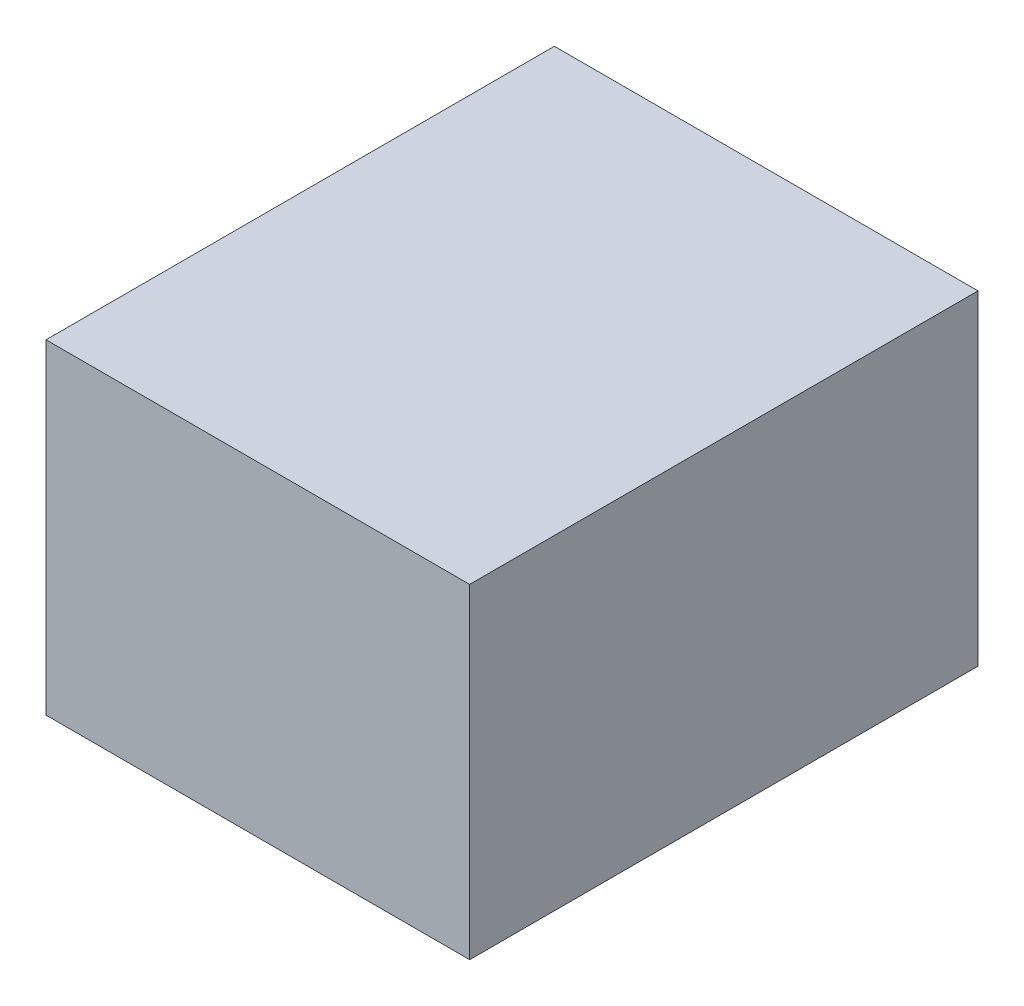
ISO-10303-21;
HEADER;
FILE_DESCRIPTION(('STEP AP214'),'2;1');
FILE_NAME('part.step','',(''),(''),'','','');
FILE_SCHEMA(('AUTOMOTIVE_DESIGN { 1 0 10303 214 1 1 1 1 }'));
ENDSEC;
DATA;
#1=APPLICATION_CONTEXT('core data for automotive mechanical design processes');
#2=APPLICATION_PROTOCOL_DEFINITION('international standard','automotive_design',2000,#1);
#3=PRODUCT_CONTEXT('',#1,'mechanical');
#4=PRODUCT('Part','Part','',(#3));
#5=PRODUCT_RELATED_PRODUCT_CATEGORY('part','',(#4));
#6=PRODUCT_DEFINITION_FORMATION('','',#4);
#7=PRODUCT_DEFINITION_CONTEXT('part definition',#1,'design');
#8=PRODUCT_DEFINITION('design','',#6,#7);
#9=PRODUCT_DEFINITION_SHAPE('','',#8);
#10=(LENGTH_UNIT() NAMED_UNIT(*) SI_UNIT(.MILLI.,.METRE.));
#11=(NAMED_UNIT(*) PLANE_ANGLE_UNIT() SI_UNIT($,.RADIAN.));
#12=(NAMED_UNIT(*) SI_UNIT($,.STERADIAN.) SOLID_ANGLE_UNIT());
#13=UNCERTAINTY_MEASURE_WITH_UNIT(LENGTH_MEASURE(1.E-05),#10,'distance_accuracy_value','');
#14=(GEOMETRIC_REPRESENTATION_CONTEXT(3) GLOBAL_UNCERTAINTY_ASSIGNED_CONTEXT((#13)) GLOBAL_UNIT_ASSIGNED_CONTEXT((#10,
#11,#12)) REPRESENTATION_CONTEXT('',''));
#15=CARTESIAN_POINT('',(0.,0.,0.));
#16=DIRECTION('',(0.,0.,1.));
#17=DIRECTION('',(1.,0.,0.));
#18=AXIS2_PLACEMENT_3D('',#15,#16,#17);
#19=CARTESIAN_POINT('',(0.,107.188,0.));
#20=DIRECTION('',(1.,0.,0.));
#21=DIRECTION('',(0.,0.,-1.));
#22=AXIS2_PLACEMENT_3D('',#19,#20,#21);
#23=PLANE('',#22);
#24=DIRECTION('',(0.,0.,1.));
#25=VECTOR('',#24,1.);
#26=CARTESIAN_POINT('',(0.,0.,0.));
#27=LINE('',#26,#25);
#28=CARTESIAN_POINT('',(0.,0.,-167.64));
#29=VERTEX_POINT('',#28);
#30=CARTESIAN_POINT('',(0.,0.,0.));
#31=VERTEX_POINT('',#30);
#32=EDGE_CURVE('E97',#29,#31,#27,.T.);
#33=ORIENTED_EDGE('',*,*,#32,.T.);
#34=DIRECTION('',(0.,-1.,0.));
#35=VECTOR('',#34,1.);
#36=CARTESIAN_POINT('',(0.,107.188,0.));
#37=LINE('',#36,#35);
#38=CARTESIAN_POINT('',(0.,107.188,0.));
#39=VERTEX_POINT('',#38);
#40=EDGE_CURVE('E11',#39,#31,#37,.T.);
#41=ORIENTED_EDGE('',*,*,#40,.F.);
#42=DIRECTION('',(0.,0.,1.));
#43=VECTOR('',#42,1.);
#44=CARTESIAN_POINT('',(0.,107.188,0.));
#45=LINE('',#44,#43);
#46=CARTESIAN_POINT('',(0.,107.188,-167.64));
#47=VERTEX_POINT('',#46);
#48=EDGE_CURVE('E85',#47,#39,#45,.T.);
#49=ORIENTED_EDGE('',*,*,#48,.F.);
#50=DIRECTION('',(0.,-1.,0.));
#51=VECTOR('',#50,1.);
#52=CARTESIAN_POINT('',(0.,107.188,-167.64));
#53=LINE('',#52,#51);
#54=EDGE_CURVE('E93',#47,#29,#53,.T.);
#55=ORIENTED_EDGE('',*,*,#54,.T.);
#56=EDGE_LOOP('',(#33,#41,#49,#55));
#57=FACE_BOUND('',#56,.T.);
#58=ADVANCED_FACE('F34',(#57),#23,.F.);
#59=CARTESIAN_POINT('',(0.,107.188,0.));
#60=DIRECTION('',(0.,0.,-1.));
#61=DIRECTION('',(-1.,0.,0.));
#62=AXIS2_PLACEMENT_3D('',#59,#60,#61);
#63=PLANE('',#62);
#64=DIRECTION('',(1.,0.,0.));
#65=VECTOR('',#64,1.);
#66=CARTESIAN_POINT('',(0.,0.,0.));
#67=LINE('',#66,#65);
#68=CARTESIAN_POINT('',(139.7,0.,0.));
#69=VERTEX_POINT('',#68);
#70=EDGE_CURVE('E89',#31,#69,#67,.T.);
#71=ORIENTED_EDGE('',*,*,#70,.T.);
#72=DIRECTION('',(0.,-1.,0.));
#73=VECTOR('',#72,1.);
#74=CARTESIAN_POINT('',(139.7,107.188,0.));
#75=LINE('',#74,#73);
#76=CARTESIAN_POINT('',(139.7,107.188,0.));
#77=VERTEX_POINT('',#76);
#78=EDGE_CURVE('E42',#77,#69,#75,.T.);
#79=ORIENTED_EDGE('',*,*,#78,.F.);
#80=DIRECTION('',(1.,0.,0.));
#81=VECTOR('',#80,1.);
#82=CARTESIAN_POINT('',(0.,107.188,0.));
#83=LINE('',#82,#81);
#84=EDGE_CURVE('E80',#39,#77,#83,.T.);
#85=ORIENTED_EDGE('',*,*,#84,.F.);
#86=ORIENTED_EDGE('',*,*,#40,.T.);
#87=EDGE_LOOP('',(#71,#79,#85,#86));
#88=FACE_BOUND('',#87,.T.);
#89=ADVANCED_FACE('F88',(#88),#63,.F.);
#90=CARTESIAN_POINT('',(139.7,107.188,0.));
#91=DIRECTION('',(-1.,0.,0.));
#92=DIRECTION('',(0.,0.,1.));
#93=AXIS2_PLACEMENT_3D('',#90,#91,#92);
#94=PLANE('',#93);
#95=DIRECTION('',(0.,0.,-1.));
#96=VECTOR('',#95,1.);
#97=CARTESIAN_POINT('',(139.7,0.,0.));
#98=LINE('',#97,#96);
#99=CARTESIAN_POINT('',(139.7,0.,-167.64));
#100=VERTEX_POINT('',#99);
#101=EDGE_CURVE('E67',#69,#100,#98,.T.);
#102=ORIENTED_EDGE('',*,*,#101,.T.);
#103=DIRECTION('',(0.,-1.,0.));
#104=VECTOR('',#103,1.);
#105=CARTESIAN_POINT('',(139.7,107.188,-167.64));
#106=LINE('',#105,#104);
#107=CARTESIAN_POINT('',(139.7,107.188,-167.64));
#108=VERTEX_POINT('',#107);
#109=EDGE_CURVE('E90',#108,#100,#106,.T.);
#110=ORIENTED_EDGE('',*,*,#109,.F.);
#111=DIRECTION('',(0.,0.,-1.));
#112=VECTOR('',#111,1.);
#113=CARTESIAN_POINT('',(139.7,107.188,0.));
#114=LINE('',#113,#112);
#115=EDGE_CURVE('E83',#77,#108,#114,.T.);
#116=ORIENTED_EDGE('',*,*,#115,.F.);
#117=ORIENTED_EDGE('',*,*,#78,.T.);
#118=EDGE_LOOP('',(#102,#110,#116,#117));
#119=FACE_BOUND('',#118,.T.);
#120=ADVANCED_FACE('F91',(#119),#94,.F.);
#121=CARTESIAN_POINT('',(0.,107.188,-167.64));
#122=DIRECTION('',(0.,0.,1.));
#123=DIRECTION('',(1.,0.,0.));
#124=AXIS2_PLACEMENT_3D('',#121,#122,#123);
#125=PLANE('',#124);
#126=DIRECTION('',(-1.,0.,0.));
#127=VECTOR('',#126,1.);
#128=CARTESIAN_POINT('',(0.,0.,-167.64));
#129=LINE('',#128,#127);
#130=EDGE_CURVE('E73',#100,#29,#129,.T.);
#131=ORIENTED_EDGE('',*,*,#130,.T.);
#132=ORIENTED_EDGE('',*,*,#54,.F.);
#133=DIRECTION('',(-1.,0.,0.));
#134=VECTOR('',#133,1.);
#135=CARTESIAN_POINT('',(0.,107.188,-167.64));
#136=LINE('',#135,#134);
#137=EDGE_CURVE('E50',#108,#47,#136,.T.);
#138=ORIENTED_EDGE('',*,*,#137,.F.);
#139=ORIENTED_EDGE('',*,*,#109,.T.);
#140=EDGE_LOOP('',(#131,#132,#138,#139));
#141=FACE_BOUND('',#140,.T.);
#142=ADVANCED_FACE('F104',(#141),#125,.F.);
#143=CARTESIAN_POINT('',(0.,107.188,0.));
#144=DIRECTION('',(0.,-1.,0.));
#145=DIRECTION('',(0.,0.,-1.));
#146=AXIS2_PLACEMENT_3D('',#143,#144,#145);
#147=PLANE('',#146);
#148=ORIENTED_EDGE('',*,*,#48,.T.);
#149=ORIENTED_EDGE('',*,*,#84,.T.);
#150=ORIENTED_EDGE('',*,*,#115,.T.);
#151=ORIENTED_EDGE('',*,*,#137,.T.);
#152=EDGE_LOOP('',(#148,#149,#150,#151));
#153=FACE_BOUND('',#152,.T.);
#154=ADVANCED_FACE('F81',(#153),#147,.F.);
#155=CARTESIAN_POINT('',(0.,0.,0.));
#156=DIRECTION('',(0.,-1.,0.));
#157=DIRECTION('',(0.,0.,-1.));
#158=AXIS2_PLACEMENT_3D('',#155,#156,#157);
#159=PLANE('',#158);
#160=ORIENTED_EDGE('',*,*,#32,.F.);
#161=ORIENTED_EDGE('',*,*,#130,.F.);
#162=ORIENTED_EDGE('',*,*,#101,.F.);
#163=ORIENTED_EDGE('',*,*,#70,.F.);
#164=EDGE_LOOP('',(#160,#161,#162,#163));
#165=FACE_BOUND('',#164,.T.);
#166=ADVANCED_FACE('F107',(#165),#159,.T.);
#167=CLOSED_SHELL('',(#58,#89,#120,#142,#154,#166));
#168=MANIFOLD_SOLID_BREP('B2',#167);
#169=ADVANCED_BREP_SHAPE_REPRESENTATION('',(#18,#168),#14);
#170=SHAPE_DEFINITION_REPRESENTATION(#9,#169);
ENDSEC;
END-ISO-10303-21;
